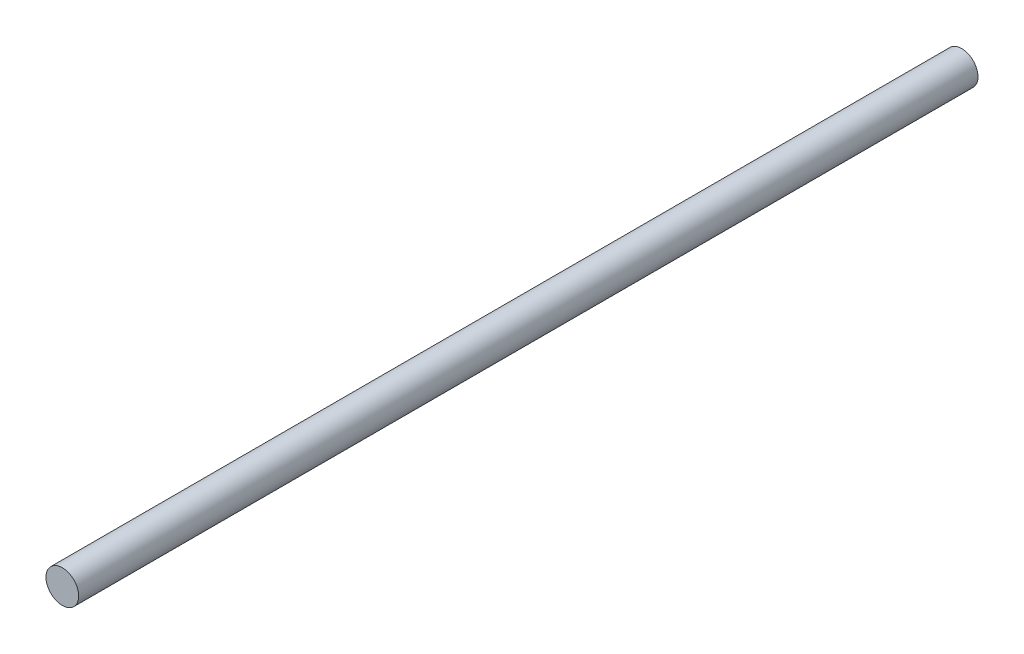
ISO-10303-21;
HEADER;
FILE_DESCRIPTION(('STEP AP214'),'2;1');
FILE_NAME('part.step','',(''),(''),'','','');
FILE_SCHEMA(('AUTOMOTIVE_DESIGN { 1 0 10303 214 1 1 1 1 }'));
ENDSEC;
DATA;
#1=APPLICATION_CONTEXT('core data for automotive mechanical design processes');
#2=APPLICATION_PROTOCOL_DEFINITION('international standard','automotive_design',2000,#1);
#3=PRODUCT_CONTEXT('',#1,'mechanical');
#4=PRODUCT('Part','Part','',(#3));
#5=PRODUCT_RELATED_PRODUCT_CATEGORY('part','',(#4));
#6=PRODUCT_DEFINITION_FORMATION('','',#4);
#7=PRODUCT_DEFINITION_CONTEXT('part definition',#1,'design');
#8=PRODUCT_DEFINITION('design','',#6,#7);
#9=PRODUCT_DEFINITION_SHAPE('','',#8);
#10=(LENGTH_UNIT() NAMED_UNIT(*) SI_UNIT(.MILLI.,.METRE.));
#11=(NAMED_UNIT(*) PLANE_ANGLE_UNIT() SI_UNIT($,.RADIAN.));
#12=(NAMED_UNIT(*) SI_UNIT($,.STERADIAN.) SOLID_ANGLE_UNIT());
#13=UNCERTAINTY_MEASURE_WITH_UNIT(LENGTH_MEASURE(1.E-05),#10,'distance_accuracy_value','');
#14=(GEOMETRIC_REPRESENTATION_CONTEXT(3) GLOBAL_UNCERTAINTY_ASSIGNED_CONTEXT((#13)) GLOBAL_UNIT_ASSIGNED_CONTEXT((#10,
#11,#12)) REPRESENTATION_CONTEXT('',''));
#15=CARTESIAN_POINT('',(0.,0.,0.));
#16=DIRECTION('',(0.,0.,1.));
#17=DIRECTION('',(1.,0.,0.));
#18=AXIS2_PLACEMENT_3D('',#15,#16,#17);
#19=CARTESIAN_POINT('',(0.,0.,-110.));
#20=DIRECTION('',(0.,0.,1.));
#21=DIRECTION('',(1.,0.,0.));
#22=AXIS2_PLACEMENT_3D('',#19,#20,#21);
#23=CYLINDRICAL_SURFACE('',#22,4.);
#24=CARTESIAN_POINT('',(0.,0.,-110.));
#25=DIRECTION('',(0.,0.,1.));
#26=DIRECTION('',(1.,0.,0.));
#27=AXIS2_PLACEMENT_3D('',#24,#25,#26);
#28=CIRCLE('',#27,4.);
#29=CARTESIAN_POINT('',(4.,0.,-110.));
#30=VERTEX_POINT('',#29);
#31=EDGE_CURVE('E10',#30,#30,#28,.T.);
#32=ORIENTED_EDGE('',*,*,#31,.T.);
#33=EDGE_LOOP('',(#32));
#34=FACE_BOUND('',#33,.T.);
#35=CARTESIAN_POINT('',(0.,0.,110.));
#36=DIRECTION('',(0.,0.,1.));
#37=DIRECTION('',(1.,0.,0.));
#38=AXIS2_PLACEMENT_3D('',#35,#36,#37);
#39=CIRCLE('',#38,4.);
#40=CARTESIAN_POINT('',(4.,0.,110.));
#41=VERTEX_POINT('',#40);
#42=EDGE_CURVE('E43',#41,#41,#39,.T.);
#43=ORIENTED_EDGE('',*,*,#42,.F.);
#44=EDGE_LOOP('',(#43));
#45=FACE_BOUND('',#44,.T.);
#46=ADVANCED_FACE('F40',(#34,#45),#23,.T.);
#47=CARTESIAN_POINT('',(0.,0.,-110.));
#48=DIRECTION('',(0.,0.,1.));
#49=DIRECTION('',(1.,0.,0.));
#50=AXIS2_PLACEMENT_3D('',#47,#48,#49);
#51=PLANE('',#50);
#52=ORIENTED_EDGE('',*,*,#31,.F.);
#53=EDGE_LOOP('',(#52));
#54=FACE_BOUND('',#53,.T.);
#55=ADVANCED_FACE('F55',(#54),#51,.F.);
#56=CARTESIAN_POINT('',(0.,0.,110.));
#57=DIRECTION('',(0.,0.,1.));
#58=DIRECTION('',(1.,0.,0.));
#59=AXIS2_PLACEMENT_3D('',#56,#57,#58);
#60=PLANE('',#59);
#61=ORIENTED_EDGE('',*,*,#42,.T.);
#62=EDGE_LOOP('',(#61));
#63=FACE_BOUND('',#62,.T.);
#64=ADVANCED_FACE('F47',(#63),#60,.T.);
#65=CLOSED_SHELL('',(#46,#55,#64));
#66=MANIFOLD_SOLID_BREP('B2',#65);
#67=ADVANCED_BREP_SHAPE_REPRESENTATION('',(#18,#66),#14);
#68=SHAPE_DEFINITION_REPRESENTATION(#9,#67);
ENDSEC;
END-ISO-10303-21;
